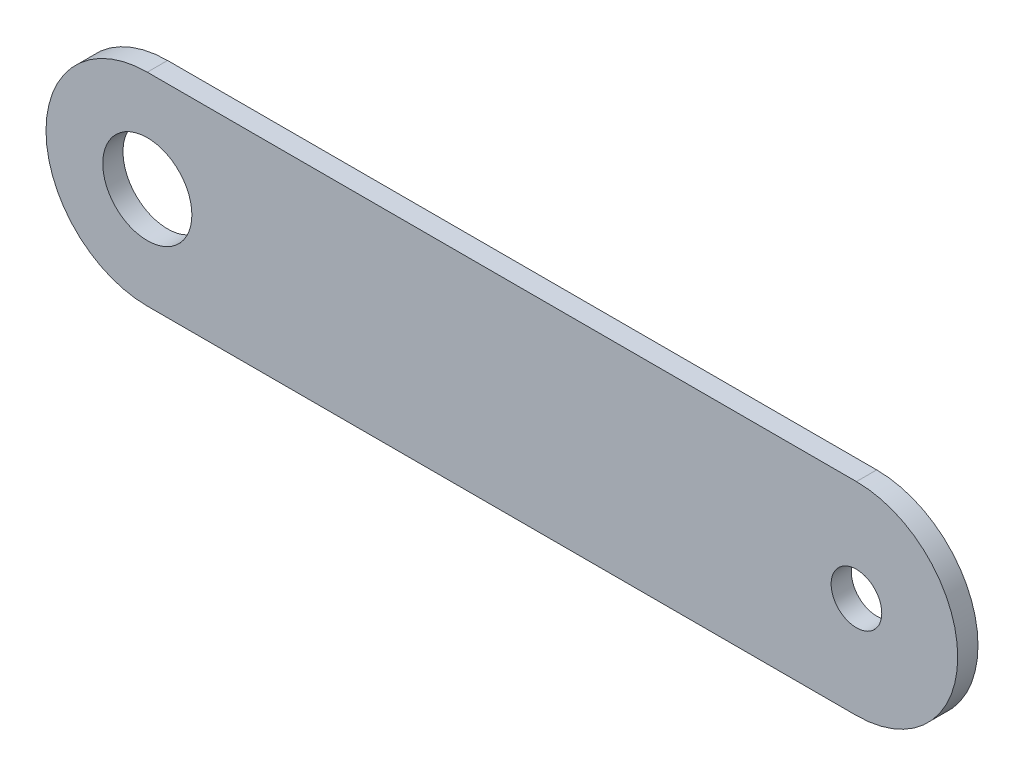
ISO-10303-21;
HEADER;
FILE_DESCRIPTION(('STEP AP214'),'2;1');
FILE_NAME('part.step','',(''),(''),'','','');
FILE_SCHEMA(('AUTOMOTIVE_DESIGN { 1 0 10303 214 1 1 1 1 }'));
ENDSEC;
DATA;
#1=APPLICATION_CONTEXT('core data for automotive mechanical design processes');
#2=APPLICATION_PROTOCOL_DEFINITION('international standard','automotive_design',2000,#1);
#3=PRODUCT_CONTEXT('',#1,'mechanical');
#4=PRODUCT('Part','Part','',(#3));
#5=PRODUCT_RELATED_PRODUCT_CATEGORY('part','',(#4));
#6=PRODUCT_DEFINITION_FORMATION('','',#4);
#7=PRODUCT_DEFINITION_CONTEXT('part definition',#1,'design');
#8=PRODUCT_DEFINITION('design','',#6,#7);
#9=PRODUCT_DEFINITION_SHAPE('','',#8);
#10=(LENGTH_UNIT() NAMED_UNIT(*) SI_UNIT(.MILLI.,.METRE.));
#11=(NAMED_UNIT(*) PLANE_ANGLE_UNIT() SI_UNIT($,.RADIAN.));
#12=(NAMED_UNIT(*) SI_UNIT($,.STERADIAN.) SOLID_ANGLE_UNIT());
#13=UNCERTAINTY_MEASURE_WITH_UNIT(LENGTH_MEASURE(1.E-05),#10,'distance_accuracy_value','');
#14=(GEOMETRIC_REPRESENTATION_CONTEXT(3) GLOBAL_UNCERTAINTY_ASSIGNED_CONTEXT((#13)) GLOBAL_UNIT_ASSIGNED_CONTEXT((#10,
#11,#12)) REPRESENTATION_CONTEXT('',''));
#15=CARTESIAN_POINT('',(0.,0.,0.));
#16=DIRECTION('',(0.,0.,1.));
#17=DIRECTION('',(1.,0.,0.));
#18=AXIS2_PLACEMENT_3D('',#15,#16,#17);
#19=CARTESIAN_POINT('',(-18.6708860759494,0.,2.));
#20=DIRECTION('',(0.,0.,1.));
#21=DIRECTION('',(1.,0.,0.));
#22=AXIS2_PLACEMENT_3D('',#19,#20,#21);
#23=PLANE('',#22);
#24=CARTESIAN_POINT('',(-18.6708860759494,0.,2.));
#25=DIRECTION('',(0.,0.,1.));
#26=DIRECTION('',(1.,0.,0.));
#27=AXIS2_PLACEMENT_3D('',#24,#25,#26);
#28=CIRCLE('',#27,4.4);
#29=CARTESIAN_POINT('',(-14.2708860759494,0.,2.));
#30=VERTEX_POINT('',#29);
#31=EDGE_CURVE('E110',#30,#30,#28,.T.);
#32=ORIENTED_EDGE('',*,*,#31,.F.);
#33=EDGE_LOOP('',(#32));
#34=FACE_BOUND('',#33,.T.);
#35=CARTESIAN_POINT('',(-18.6708860759494,0.,2.));
#36=DIRECTION('',(0.,0.,1.));
#37=DIRECTION('',(1.,0.,0.));
#38=AXIS2_PLACEMENT_3D('',#35,#36,#37);
#39=CIRCLE('',#38,10.);
#40=CARTESIAN_POINT('',(-18.6708860759494,10.,2.));
#41=VERTEX_POINT('',#40);
#42=CARTESIAN_POINT('',(-18.6708860759494,-10.,2.));
#43=VERTEX_POINT('',#42);
#44=EDGE_CURVE('E95',#41,#43,#39,.T.);
#45=ORIENTED_EDGE('',*,*,#44,.T.);
#46=DIRECTION('',(1.,0.,0.));
#47=VECTOR('',#46,1.);
#48=CARTESIAN_POINT('',(-18.6708860759494,-10.,2.));
#49=LINE('',#48,#47);
#50=CARTESIAN_POINT('',(51.3291139240506,-10.,2.));
#51=VERTEX_POINT('',#50);
#52=EDGE_CURVE('E90',#43,#51,#49,.T.);
#53=ORIENTED_EDGE('',*,*,#52,.T.);
#54=CARTESIAN_POINT('',(51.3291139240506,0.,2.));
#55=DIRECTION('',(0.,0.,1.));
#56=DIRECTION('',(1.,0.,0.));
#57=AXIS2_PLACEMENT_3D('',#54,#55,#56);
#58=CIRCLE('',#57,10.);
#59=CARTESIAN_POINT('',(51.3291139240506,10.,2.));
#60=VERTEX_POINT('',#59);
#61=EDGE_CURVE('E93',#51,#60,#58,.T.);
#62=ORIENTED_EDGE('',*,*,#61,.T.);
#63=DIRECTION('',(-1.,0.,0.));
#64=VECTOR('',#63,1.);
#65=CARTESIAN_POINT('',(-18.6708860759494,10.,2.));
#66=LINE('',#65,#64);
#67=EDGE_CURVE('E60',#60,#41,#66,.T.);
#68=ORIENTED_EDGE('',*,*,#67,.T.);
#69=EDGE_LOOP('',(#45,#53,#62,#68));
#70=FACE_BOUND('',#69,.T.);
#71=CARTESIAN_POINT('',(51.3291139240506,0.,2.));
#72=DIRECTION('',(0.,0.,1.));
#73=DIRECTION('',(1.,0.,0.));
#74=AXIS2_PLACEMENT_3D('',#71,#72,#73);
#75=CIRCLE('',#74,2.5);
#76=CARTESIAN_POINT('',(53.8291139240506,0.,2.));
#77=VERTEX_POINT('',#76);
#78=EDGE_CURVE('E125',#77,#77,#75,.T.);
#79=ORIENTED_EDGE('',*,*,#78,.F.);
#80=EDGE_LOOP('',(#79));
#81=FACE_BOUND('',#80,.T.);
#82=ADVANCED_FACE('F43',(#34,#70,#81),#23,.T.);
#83=CARTESIAN_POINT('',(-18.6708860759494,0.,0.));
#84=DIRECTION('',(0.,0.,1.));
#85=DIRECTION('',(1.,0.,0.));
#86=AXIS2_PLACEMENT_3D('',#83,#84,#85);
#87=PLANE('',#86);
#88=CARTESIAN_POINT('',(-18.6708860759494,0.,0.));
#89=DIRECTION('',(0.,0.,1.));
#90=DIRECTION('',(1.,0.,0.));
#91=AXIS2_PLACEMENT_3D('',#88,#89,#90);
#92=CIRCLE('',#91,10.);
#93=CARTESIAN_POINT('',(-18.6708860759494,10.,0.));
#94=VERTEX_POINT('',#93);
#95=CARTESIAN_POINT('',(-18.6708860759494,-10.,0.));
#96=VERTEX_POINT('',#95);
#97=EDGE_CURVE('E107',#94,#96,#92,.T.);
#98=ORIENTED_EDGE('',*,*,#97,.F.);
#99=DIRECTION('',(-1.,0.,0.));
#100=VECTOR('',#99,1.);
#101=CARTESIAN_POINT('',(-18.6708860759494,10.,0.));
#102=LINE('',#101,#100);
#103=CARTESIAN_POINT('',(51.3291139240506,10.,0.));
#104=VERTEX_POINT('',#103);
#105=EDGE_CURVE('E83',#104,#94,#102,.T.);
#106=ORIENTED_EDGE('',*,*,#105,.F.);
#107=CARTESIAN_POINT('',(51.3291139240506,0.,0.));
#108=DIRECTION('',(0.,0.,1.));
#109=DIRECTION('',(1.,0.,0.));
#110=AXIS2_PLACEMENT_3D('',#107,#108,#109);
#111=CIRCLE('',#110,10.);
#112=CARTESIAN_POINT('',(51.3291139240506,-10.,0.));
#113=VERTEX_POINT('',#112);
#114=EDGE_CURVE('E77',#113,#104,#111,.T.);
#115=ORIENTED_EDGE('',*,*,#114,.F.);
#116=DIRECTION('',(1.,0.,0.));
#117=VECTOR('',#116,1.);
#118=CARTESIAN_POINT('',(-18.6708860759494,-10.,0.));
#119=LINE('',#118,#117);
#120=EDGE_CURVE('E99',#96,#113,#119,.T.);
#121=ORIENTED_EDGE('',*,*,#120,.F.);
#122=EDGE_LOOP('',(#98,#106,#115,#121));
#123=FACE_BOUND('',#122,.T.);
#124=CARTESIAN_POINT('',(-18.6708860759494,0.,0.));
#125=DIRECTION('',(0.,0.,1.));
#126=DIRECTION('',(1.,0.,0.));
#127=AXIS2_PLACEMENT_3D('',#124,#125,#126);
#128=CIRCLE('',#127,4.4);
#129=CARTESIAN_POINT('',(-14.2708860759494,0.,0.));
#130=VERTEX_POINT('',#129);
#131=EDGE_CURVE('E122',#130,#130,#128,.T.);
#132=ORIENTED_EDGE('',*,*,#131,.T.);
#133=EDGE_LOOP('',(#132));
#134=FACE_BOUND('',#133,.T.);
#135=CARTESIAN_POINT('',(51.3291139240506,0.,0.));
#136=DIRECTION('',(0.,0.,1.));
#137=DIRECTION('',(1.,0.,0.));
#138=AXIS2_PLACEMENT_3D('',#135,#136,#137);
#139=CIRCLE('',#138,2.5);
#140=CARTESIAN_POINT('',(53.8291139240506,0.,0.));
#141=VERTEX_POINT('',#140);
#142=EDGE_CURVE('E128',#141,#141,#139,.T.);
#143=ORIENTED_EDGE('',*,*,#142,.T.);
#144=EDGE_LOOP('',(#143));
#145=FACE_BOUND('',#144,.T.);
#146=ADVANCED_FACE('F118',(#123,#134,#145),#87,.F.);
#147=CARTESIAN_POINT('',(-18.6708860759494,0.,2.));
#148=DIRECTION('',(0.,0.,-1.));
#149=DIRECTION('',(-1.,0.,0.));
#150=AXIS2_PLACEMENT_3D('',#147,#148,#149);
#151=CYLINDRICAL_SURFACE('',#150,10.);
#152=ORIENTED_EDGE('',*,*,#97,.T.);
#153=DIRECTION('',(0.,0.,-1.));
#154=VECTOR('',#153,1.);
#155=CARTESIAN_POINT('',(-18.6708860759494,-10.,2.));
#156=LINE('',#155,#154);
#157=EDGE_CURVE('E11',#43,#96,#156,.T.);
#158=ORIENTED_EDGE('',*,*,#157,.F.);
#159=ORIENTED_EDGE('',*,*,#44,.F.);
#160=DIRECTION('',(0.,0.,-1.));
#161=VECTOR('',#160,1.);
#162=CARTESIAN_POINT('',(-18.6708860759494,10.,2.));
#163=LINE('',#162,#161);
#164=EDGE_CURVE('E103',#41,#94,#163,.T.);
#165=ORIENTED_EDGE('',*,*,#164,.T.);
#166=EDGE_LOOP('',(#152,#158,#159,#165));
#167=FACE_BOUND('',#166,.T.);
#168=ADVANCED_FACE('F45',(#167),#151,.T.);
#169=CARTESIAN_POINT('',(-18.6708860759494,-10.,2.));
#170=DIRECTION('',(0.,1.,0.));
#171=DIRECTION('',(0.,0.,1.));
#172=AXIS2_PLACEMENT_3D('',#169,#170,#171);
#173=PLANE('',#172);
#174=ORIENTED_EDGE('',*,*,#120,.T.);
#175=DIRECTION('',(0.,0.,-1.));
#176=VECTOR('',#175,1.);
#177=CARTESIAN_POINT('',(51.3291139240506,-10.,2.));
#178=LINE('',#177,#176);
#179=EDGE_CURVE('E52',#51,#113,#178,.T.);
#180=ORIENTED_EDGE('',*,*,#179,.F.);
#181=ORIENTED_EDGE('',*,*,#52,.F.);
#182=ORIENTED_EDGE('',*,*,#157,.T.);
#183=EDGE_LOOP('',(#174,#180,#181,#182));
#184=FACE_BOUND('',#183,.T.);
#185=ADVANCED_FACE('F98',(#184),#173,.F.);
#186=CARTESIAN_POINT('',(51.3291139240506,0.,2.));
#187=DIRECTION('',(0.,0.,-1.));
#188=DIRECTION('',(-1.,0.,0.));
#189=AXIS2_PLACEMENT_3D('',#186,#187,#188);
#190=CYLINDRICAL_SURFACE('',#189,10.);
#191=ORIENTED_EDGE('',*,*,#114,.T.);
#192=DIRECTION('',(0.,0.,-1.));
#193=VECTOR('',#192,1.);
#194=CARTESIAN_POINT('',(51.3291139240506,10.,2.));
#195=LINE('',#194,#193);
#196=EDGE_CURVE('E100',#60,#104,#195,.T.);
#197=ORIENTED_EDGE('',*,*,#196,.F.);
#198=ORIENTED_EDGE('',*,*,#61,.F.);
#199=ORIENTED_EDGE('',*,*,#179,.T.);
#200=EDGE_LOOP('',(#191,#197,#198,#199));
#201=FACE_BOUND('',#200,.T.);
#202=ADVANCED_FACE('F101',(#201),#190,.T.);
#203=CARTESIAN_POINT('',(-18.6708860759494,10.,2.));
#204=DIRECTION('',(0.,-1.,0.));
#205=DIRECTION('',(0.,0.,-1.));
#206=AXIS2_PLACEMENT_3D('',#203,#204,#205);
#207=PLANE('',#206);
#208=ORIENTED_EDGE('',*,*,#105,.T.);
#209=ORIENTED_EDGE('',*,*,#164,.F.);
#210=ORIENTED_EDGE('',*,*,#67,.F.);
#211=ORIENTED_EDGE('',*,*,#196,.T.);
#212=EDGE_LOOP('',(#208,#209,#210,#211));
#213=FACE_BOUND('',#212,.T.);
#214=ADVANCED_FACE('F115',(#213),#207,.F.);
#215=CARTESIAN_POINT('',(-18.6708860759494,0.,2.));
#216=DIRECTION('',(0.,0.,-1.));
#217=DIRECTION('',(-1.,0.,0.));
#218=AXIS2_PLACEMENT_3D('',#215,#216,#217);
#219=CYLINDRICAL_SURFACE('',#218,4.4);
#220=ORIENTED_EDGE('',*,*,#31,.T.);
#221=EDGE_LOOP('',(#220));
#222=FACE_BOUND('',#221,.T.);
#223=ORIENTED_EDGE('',*,*,#131,.F.);
#224=EDGE_LOOP('',(#223));
#225=FACE_BOUND('',#224,.T.);
#226=ADVANCED_FACE('F145',(#222,#225),#219,.F.);
#227=CARTESIAN_POINT('',(51.3291139240506,0.,2.));
#228=DIRECTION('',(0.,0.,-1.));
#229=DIRECTION('',(-1.,0.,0.));
#230=AXIS2_PLACEMENT_3D('',#227,#228,#229);
#231=CYLINDRICAL_SURFACE('',#230,2.5);
#232=ORIENTED_EDGE('',*,*,#78,.T.);
#233=EDGE_LOOP('',(#232));
#234=FACE_BOUND('',#233,.T.);
#235=ORIENTED_EDGE('',*,*,#142,.F.);
#236=EDGE_LOOP('',(#235));
#237=FACE_BOUND('',#236,.T.);
#238=ADVANCED_FACE('F134',(#234,#237),#231,.F.);
#239=CLOSED_SHELL('',(#82,#146,#168,#185,#202,#214,#226,#238));
#240=MANIFOLD_SOLID_BREP('B2',#239);
#241=ADVANCED_BREP_SHAPE_REPRESENTATION('',(#18,#240),#14);
#242=SHAPE_DEFINITION_REPRESENTATION(#9,#241);
ENDSEC;
END-ISO-10303-21;
